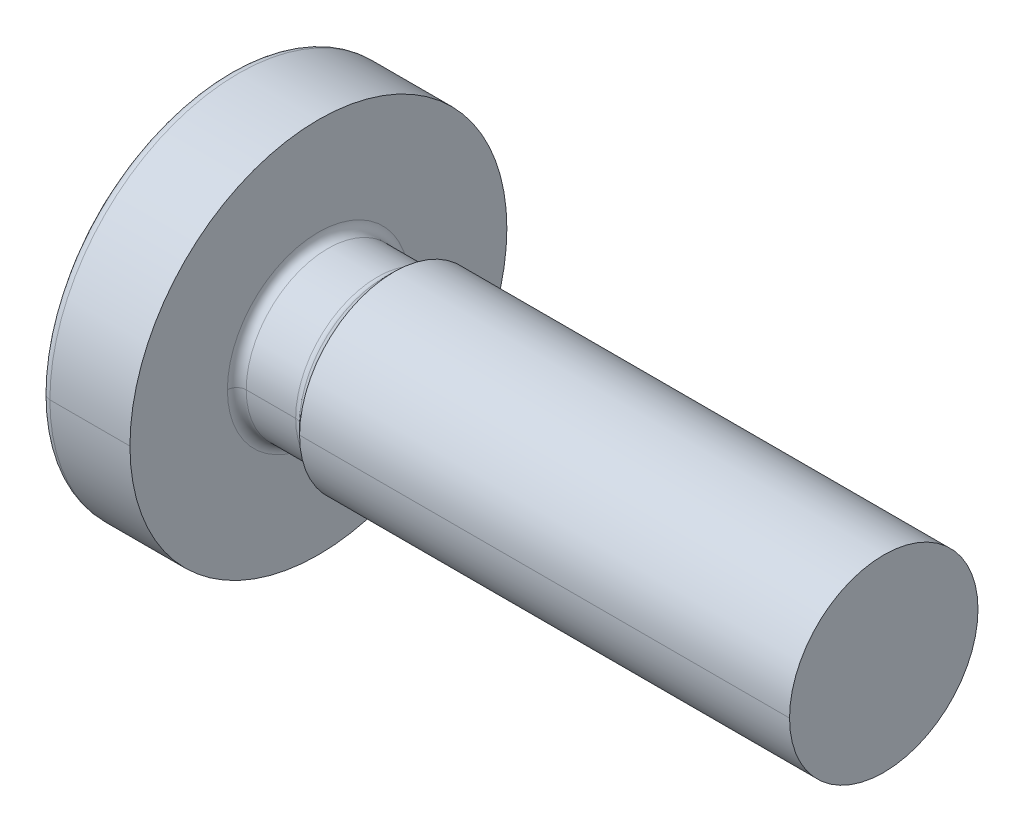
ISO-10303-21;
HEADER;
FILE_DESCRIPTION(('STEP AP214'),'2;1');
FILE_NAME('part.step','',(''),(''),'','','');
FILE_SCHEMA(('AUTOMOTIVE_DESIGN { 1 0 10303 214 1 1 1 1 }'));
ENDSEC;
DATA;
#1=APPLICATION_CONTEXT('core data for automotive mechanical design processes');
#2=APPLICATION_PROTOCOL_DEFINITION('international standard','automotive_design',2000,#1);
#3=PRODUCT_CONTEXT('',#1,'mechanical');
#4=PRODUCT('Part','Part','',(#3));
#5=PRODUCT_RELATED_PRODUCT_CATEGORY('part','',(#4));
#6=PRODUCT_DEFINITION_FORMATION('','',#4);
#7=PRODUCT_DEFINITION_CONTEXT('part definition',#1,'design');
#8=PRODUCT_DEFINITION('design','',#6,#7);
#9=PRODUCT_DEFINITION_SHAPE('','',#8);
#10=(LENGTH_UNIT() NAMED_UNIT(*) SI_UNIT(.MILLI.,.METRE.));
#11=(NAMED_UNIT(*) PLANE_ANGLE_UNIT() SI_UNIT($,.RADIAN.));
#12=(NAMED_UNIT(*) SI_UNIT($,.STERADIAN.) SOLID_ANGLE_UNIT());
#13=UNCERTAINTY_MEASURE_WITH_UNIT(LENGTH_MEASURE(1.E-05),#10,'distance_accuracy_value','');
#14=(GEOMETRIC_REPRESENTATION_CONTEXT(3) GLOBAL_UNCERTAINTY_ASSIGNED_CONTEXT((#13)) GLOBAL_UNIT_ASSIGNED_CONTEXT((#10,
#11,#12)) REPRESENTATION_CONTEXT('',''));
#15=CARTESIAN_POINT('',(0.,0.,0.));
#16=DIRECTION('',(0.,0.,1.));
#17=DIRECTION('',(1.,0.,0.));
#18=AXIS2_PLACEMENT_3D('',#15,#16,#17);
#19=CARTESIAN_POINT('',(1.7,0.,0.));
#20=DIRECTION('',(-1.,0.,0.));
#21=DIRECTION('',(0.,0.,1.));
#22=AXIS2_PLACEMENT_3D('',#19,#20,#21);
#23=TOROIDAL_SURFACE('',#22,0.966,0.1);
#24=CARTESIAN_POINT('',(1.6,0.,0.));
#25=DIRECTION('',(-1.,0.,0.));
#26=DIRECTION('',(0.,0.,1.));
#27=AXIS2_PLACEMENT_3D('',#24,#25,#26);
#28=CIRCLE('',#27,0.966);
#29=CARTESIAN_POINT('',(1.6,0.,-0.966));
#30=VERTEX_POINT('',#29);
#31=CARTESIAN_POINT('',(1.6,0.,0.966));
#32=VERTEX_POINT('',#31);
#33=EDGE_CURVE('E41',#30,#32,#28,.T.);
#34=ORIENTED_EDGE('',*,*,#33,.F.);
#35=CARTESIAN_POINT('',(1.7,0.,-0.966));
#36=DIRECTION('',(0.,1.,0.));
#37=DIRECTION('',(0.,0.,1.));
#38=AXIS2_PLACEMENT_3D('',#35,#36,#37);
#39=CIRCLE('',#38,0.1);
#40=CARTESIAN_POINT('',(1.7,0.,-0.866));
#41=VERTEX_POINT('',#40);
#42=EDGE_CURVE('E10',#30,#41,#39,.T.);
#43=ORIENTED_EDGE('',*,*,#42,.T.);
#44=CARTESIAN_POINT('',(1.7,0.,0.));
#45=DIRECTION('',(1.,0.,0.));
#46=DIRECTION('',(0.,0.,1.));
#47=AXIS2_PLACEMENT_3D('',#44,#45,#46);
#48=CIRCLE('',#47,0.866);
#49=CARTESIAN_POINT('',(1.7,0.,0.866));
#50=VERTEX_POINT('',#49);
#51=EDGE_CURVE('E371',#50,#41,#48,.T.);
#52=ORIENTED_EDGE('',*,*,#51,.F.);
#53=CARTESIAN_POINT('',(1.7,0.,0.966));
#54=DIRECTION('',(0.,-1.,0.));
#55=DIRECTION('',(0.,0.,-1.));
#56=AXIS2_PLACEMENT_3D('',#53,#54,#55);
#57=CIRCLE('',#56,0.1);
#58=EDGE_CURVE('E299',#32,#50,#57,.T.);
#59=ORIENTED_EDGE('',*,*,#58,.F.);
#60=EDGE_LOOP('',(#34,#43,#52,#59));
#61=FACE_BOUND('',#60,.T.);
#62=ADVANCED_FACE('F16',(#61),#23,.F.);
#63=CARTESIAN_POINT('',(2.2245786437627,0.,0.));
#64=DIRECTION('',(-1.,0.,0.));
#65=DIRECTION('',(0.,0.,1.));
#66=AXIS2_PLACEMENT_3D('',#63,#64,#65);
#67=TOROIDAL_SURFACE('',#66,0.966,0.1);
#68=CARTESIAN_POINT('',(2.2245786437627,0.,0.));
#69=DIRECTION('',(-1.,0.,0.));
#70=DIRECTION('',(0.,0.,1.));
#71=AXIS2_PLACEMENT_3D('',#68,#69,#70);
#72=CIRCLE('',#71,0.866);
#73=CARTESIAN_POINT('',(2.2245786437627,0.,-0.866));
#74=VERTEX_POINT('',#73);
#75=CARTESIAN_POINT('',(2.2245786437627,0.,0.866));
#76=VERTEX_POINT('',#75);
#77=EDGE_CURVE('E370',#74,#76,#72,.T.);
#78=ORIENTED_EDGE('',*,*,#77,.F.);
#79=CARTESIAN_POINT('',(2.2245786437627,0.,-0.966));
#80=DIRECTION('',(0.,1.,0.));
#81=DIRECTION('',(0.,0.,1.));
#82=AXIS2_PLACEMENT_3D('',#79,#80,#81);
#83=CIRCLE('',#82,0.1);
#84=CARTESIAN_POINT('',(2.29528932188135,0.,-0.895289321881345));
#85=VERTEX_POINT('',#84);
#86=EDGE_CURVE('E27',#74,#85,#83,.T.);
#87=ORIENTED_EDGE('',*,*,#86,.T.);
#88=CARTESIAN_POINT('',(2.29528932188135,0.,0.));
#89=DIRECTION('',(1.,0.,0.));
#90=DIRECTION('',(0.,0.,-1.));
#91=AXIS2_PLACEMENT_3D('',#88,#89,#90);
#92=CIRCLE('',#91,0.895289321881345);
#93=CARTESIAN_POINT('',(2.29528932188135,0.,0.895289321881345));
#94=VERTEX_POINT('',#93);
#95=EDGE_CURVE('E450',#94,#85,#92,.T.);
#96=ORIENTED_EDGE('',*,*,#95,.F.);
#97=CARTESIAN_POINT('',(2.2245786437627,0.,0.966));
#98=DIRECTION('',(0.,-1.,0.));
#99=DIRECTION('',(0.,0.,-1.));
#100=AXIS2_PLACEMENT_3D('',#97,#98,#99);
#101=CIRCLE('',#100,0.1);
#102=EDGE_CURVE('E302',#76,#94,#101,.T.);
#103=ORIENTED_EDGE('',*,*,#102,.F.);
#104=EDGE_LOOP('',(#78,#87,#96,#103));
#105=FACE_BOUND('',#104,.T.);
#106=ADVANCED_FACE('F1056',(#105),#67,.F.);
#107=CARTESIAN_POINT('',(0.750510257216821,0.,0.));
#108=DIRECTION('',(1.,0.,0.));
#109=DIRECTION('',(0.,0.,-1.));
#110=AXIS2_PLACEMENT_3D('',#107,#108,#109);
#111=TOROIDAL_SURFACE('',#110,1.9,0.1);
#112=CARTESIAN_POINT('',(0.671494459062525,0.,0.));
#113=DIRECTION('',(-1.,0.,0.));
#114=DIRECTION('',(0.,0.,-1.));
#115=AXIS2_PLACEMENT_3D('',#112,#113,#114);
#116=CIRCLE('',#115,1.96129032258065);
#117=CARTESIAN_POINT('',(0.671494459062525,0.,1.96129032258065));
#118=VERTEX_POINT('',#117);
#119=CARTESIAN_POINT('',(0.671494459062525,1.96129032258065,0.));
#120=VERTEX_POINT('',#119);
#121=EDGE_CURVE('E20',#118,#120,#116,.T.);
#122=ORIENTED_EDGE('',*,*,#121,.F.);
#123=CARTESIAN_POINT('',(0.750510257216821,0.,1.9));
#124=DIRECTION('',(0.,1.,0.));
#125=DIRECTION('',(0.,0.,1.));
#126=AXIS2_PLACEMENT_3D('',#123,#124,#125);
#127=CIRCLE('',#126,0.1);
#128=CARTESIAN_POINT('',(0.750510257216821,0.,2.));
#129=VERTEX_POINT('',#128);
#130=EDGE_CURVE('E462',#118,#129,#127,.T.);
#131=ORIENTED_EDGE('',*,*,#130,.T.);
#132=CARTESIAN_POINT('',(0.750510257216821,0.,0.));
#133=DIRECTION('',(1.,0.,0.));
#134=DIRECTION('',(0.,0.,-1.));
#135=AXIS2_PLACEMENT_3D('',#132,#133,#134);
#136=CIRCLE('',#135,2.);
#137=CARTESIAN_POINT('',(0.750510257216821,0.,-2.));
#138=VERTEX_POINT('',#137);
#139=EDGE_CURVE('E400',#138,#129,#136,.T.);
#140=ORIENTED_EDGE('',*,*,#139,.F.);
#141=CARTESIAN_POINT('',(0.750510257216821,0.,-1.9));
#142=DIRECTION('',(0.,-1.,0.));
#143=DIRECTION('',(0.,0.,-1.));
#144=AXIS2_PLACEMENT_3D('',#141,#142,#143);
#145=CIRCLE('',#144,0.1);
#146=CARTESIAN_POINT('',(0.671494459062525,0.,-1.96129032258065));
#147=VERTEX_POINT('',#146);
#148=EDGE_CURVE('E304',#147,#138,#145,.T.);
#149=ORIENTED_EDGE('',*,*,#148,.F.);
#150=CARTESIAN_POINT('',(0.671494459062525,0.,0.));
#151=DIRECTION('',(-1.,0.,0.));
#152=DIRECTION('',(0.,0.,-1.));
#153=AXIS2_PLACEMENT_3D('',#150,#151,#152);
#154=CIRCLE('',#153,1.96129032258065);
#155=EDGE_CURVE('E339',#120,#147,#154,.T.);
#156=ORIENTED_EDGE('',*,*,#155,.F.);
#157=EDGE_LOOP('',(#122,#131,#140,#149,#156));
#158=FACE_BOUND('',#157,.T.);
#159=ADVANCED_FACE('F1052',(#158),#111,.T.);
#160=CARTESIAN_POINT('',(-3.4420013783492,0.,0.));
#161=DIRECTION('',(-1.,0.,0.));
#162=DIRECTION('',(0.,0.,1.));
#163=AXIS2_PLACEMENT_3D('',#160,#161,#162);
#164=CYLINDRICAL_SURFACE('',#163,1.);
#165=CARTESIAN_POINT('',(7.6,0.,0.));
#166=DIRECTION('',(-1.,0.,0.));
#167=DIRECTION('',(0.,0.,1.));
#168=AXIS2_PLACEMENT_3D('',#165,#166,#167);
#169=CIRCLE('',#168,1.);
#170=CARTESIAN_POINT('',(7.6,0.,1.));
#171=VERTEX_POINT('',#170);
#172=CARTESIAN_POINT('',(7.6,0.,-1.));
#173=VERTEX_POINT('',#172);
#174=EDGE_CURVE('E440',#171,#173,#169,.T.);
#175=ORIENTED_EDGE('',*,*,#174,.T.);
#176=DIRECTION('',(-1.,0.,0.));
#177=VECTOR('',#176,1.);
#178=CARTESIAN_POINT('',(-3.4420013783492,0.,-1.));
#179=LINE('',#178,#177);
#180=CARTESIAN_POINT('',(2.4,0.,-1.));
#181=VERTEX_POINT('',#180);
#182=EDGE_CURVE('E416',#173,#181,#179,.T.);
#183=ORIENTED_EDGE('',*,*,#182,.T.);
#184=CARTESIAN_POINT('',(2.4,0.,0.));
#185=DIRECTION('',(-1.,0.,0.));
#186=DIRECTION('',(0.,0.,1.));
#187=AXIS2_PLACEMENT_3D('',#184,#185,#186);
#188=CIRCLE('',#187,1.);
#189=CARTESIAN_POINT('',(2.4,0.,1.));
#190=VERTEX_POINT('',#189);
#191=EDGE_CURVE('E313',#190,#181,#188,.T.);
#192=ORIENTED_EDGE('',*,*,#191,.F.);
#193=DIRECTION('',(-1.,0.,0.));
#194=VECTOR('',#193,1.);
#195=CARTESIAN_POINT('',(-3.4420013783492,0.,1.));
#196=LINE('',#195,#194);
#197=EDGE_CURVE('E221',#171,#190,#196,.T.);
#198=ORIENTED_EDGE('',*,*,#197,.F.);
#199=EDGE_LOOP('',(#175,#183,#192,#198));
#200=FACE_BOUND('',#199,.T.);
#201=ADVANCED_FACE('F1046',(#200),#164,.T.);
#202=CARTESIAN_POINT('',(2.4,0.,0.));
#203=DIRECTION('',(1.,0.,0.));
#204=DIRECTION('',(0.,0.,-1.));
#205=AXIS2_PLACEMENT_3D('',#202,#203,#204);
#206=CONICAL_SURFACE('',#205,1.,0.785398163397438);
#207=CARTESIAN_POINT('',(2.29528932188135,0.,0.));
#208=DIRECTION('',(1.,0.,0.));
#209=DIRECTION('',(0.,0.,-1.));
#210=AXIS2_PLACEMENT_3D('',#207,#208,#209);
#211=CIRCLE('',#210,0.895289321881345);
#212=EDGE_CURVE('E412',#85,#94,#211,.T.);
#213=ORIENTED_EDGE('',*,*,#212,.T.);
#214=DIRECTION('',(0.707106781186554,0.,0.707106781186541));
#215=VECTOR('',#214,1.);
#216=CARTESIAN_POINT('',(2.4,0.,1.));
#217=LINE('',#216,#215);
#218=EDGE_CURVE('E317',#94,#190,#217,.T.);
#219=ORIENTED_EDGE('',*,*,#218,.T.);
#220=ORIENTED_EDGE('',*,*,#191,.T.);
#221=DIRECTION('',(0.707106781186554,0.,-0.707106781186541));
#222=VECTOR('',#221,1.);
#223=CARTESIAN_POINT('',(2.4,0.,-1.));
#224=LINE('',#223,#222);
#225=EDGE_CURVE('E323',#85,#181,#224,.T.);
#226=ORIENTED_EDGE('',*,*,#225,.F.);
#227=EDGE_LOOP('',(#213,#219,#220,#226));
#228=FACE_BOUND('',#227,.T.);
#229=ADVANCED_FACE('F1041',(#228),#206,.T.);
#230=CARTESIAN_POINT('',(-3.4420013783492,0.,0.));
#231=DIRECTION('',(-1.,0.,0.));
#232=DIRECTION('',(0.,0.,1.));
#233=AXIS2_PLACEMENT_3D('',#230,#231,#232);
#234=CYLINDRICAL_SURFACE('',#233,0.866);
#235=CARTESIAN_POINT('',(2.2245786437627,0.,0.));
#236=DIRECTION('',(-1.,0.,0.));
#237=DIRECTION('',(0.,0.,1.));
#238=AXIS2_PLACEMENT_3D('',#235,#236,#237);
#239=CIRCLE('',#238,0.866);
#240=EDGE_CURVE('E318',#76,#74,#239,.T.);
#241=ORIENTED_EDGE('',*,*,#240,.T.);
#242=DIRECTION('',(-1.,0.,0.));
#243=VECTOR('',#242,1.);
#244=CARTESIAN_POINT('',(-3.4420013783492,0.,-0.866));
#245=LINE('',#244,#243);
#246=EDGE_CURVE('E459',#74,#41,#245,.T.);
#247=ORIENTED_EDGE('',*,*,#246,.T.);
#248=CARTESIAN_POINT('',(1.7,0.,0.));
#249=DIRECTION('',(1.,0.,0.));
#250=DIRECTION('',(0.,0.,1.));
#251=AXIS2_PLACEMENT_3D('',#248,#249,#250);
#252=CIRCLE('',#251,0.866);
#253=EDGE_CURVE('E484',#41,#50,#252,.T.);
#254=ORIENTED_EDGE('',*,*,#253,.T.);
#255=DIRECTION('',(-1.,0.,0.));
#256=VECTOR('',#255,1.);
#257=CARTESIAN_POINT('',(-3.4420013783492,0.,0.866));
#258=LINE('',#257,#256);
#259=EDGE_CURVE('E366',#76,#50,#258,.T.);
#260=ORIENTED_EDGE('',*,*,#259,.F.);
#261=EDGE_LOOP('',(#241,#247,#254,#260));
#262=FACE_BOUND('',#261,.T.);
#263=ADVANCED_FACE('F1045',(#262),#234,.T.);
#264=CARTESIAN_POINT('',(-3.4420013783492,0.,0.));
#265=DIRECTION('',(-1.,0.,0.));
#266=DIRECTION('',(0.,0.,1.));
#267=AXIS2_PLACEMENT_3D('',#264,#265,#266);
#268=CYLINDRICAL_SURFACE('',#267,2.);
#269=CARTESIAN_POINT('',(1.6,0.,0.));
#270=DIRECTION('',(-1.,0.,0.));
#271=DIRECTION('',(0.,0.,1.));
#272=AXIS2_PLACEMENT_3D('',#269,#270,#271);
#273=CIRCLE('',#272,2.);
#274=CARTESIAN_POINT('',(1.6,0.,2.));
#275=VERTEX_POINT('',#274);
#276=CARTESIAN_POINT('',(1.6,0.,-2.));
#277=VERTEX_POINT('',#276);
#278=EDGE_CURVE('E498',#275,#277,#273,.T.);
#279=ORIENTED_EDGE('',*,*,#278,.T.);
#280=DIRECTION('',(-1.,0.,0.));
#281=VECTOR('',#280,1.);
#282=CARTESIAN_POINT('',(-3.4420013783492,0.,-2.));
#283=LINE('',#282,#281);
#284=EDGE_CURVE('E208',#277,#138,#283,.T.);
#285=ORIENTED_EDGE('',*,*,#284,.T.);
#286=ORIENTED_EDGE('',*,*,#139,.T.);
#287=DIRECTION('',(-1.,0.,0.));
#288=VECTOR('',#287,1.);
#289=CARTESIAN_POINT('',(-3.4420013783492,0.,2.));
#290=LINE('',#289,#288);
#291=EDGE_CURVE('E534',#275,#129,#290,.T.);
#292=ORIENTED_EDGE('',*,*,#291,.F.);
#293=EDGE_LOOP('',(#279,#285,#286,#292));
#294=FACE_BOUND('',#293,.T.);
#295=ADVANCED_FACE('F1135',(#294),#268,.T.);
#296=CARTESIAN_POINT('',(3.2,0.,0.));
#297=DIRECTION('',(0.,0.,-1.));
#298=DIRECTION('',(0.,1.,0.));
#299=AXIS2_PLACEMENT_3D('',#296,#297,#298);
#300=SPHERICAL_SURFACE('',#299,3.2);
#301=ORIENTED_EDGE('',*,*,#155,.T.);
#302=CARTESIAN_POINT('',(0.671494459062525,0.,0.));
#303=DIRECTION('',(-1.,0.,0.));
#304=DIRECTION('',(0.,0.,-1.));
#305=AXIS2_PLACEMENT_3D('',#302,#303,#304);
#306=CIRCLE('',#305,1.96129032258065);
#307=CARTESIAN_POINT('',(0.671494459062525,-1.96129032258065,0.));
#308=VERTEX_POINT('',#307);
#309=EDGE_CURVE('E335',#147,#308,#306,.T.);
#310=ORIENTED_EDGE('',*,*,#309,.T.);
#311=CARTESIAN_POINT('',(3.2,0.,0.));
#312=DIRECTION('',(0.,0.,-1.));
#313=DIRECTION('',(0.,1.,0.));
#314=AXIS2_PLACEMENT_3D('',#311,#312,#313);
#315=CIRCLE('',#314,3.2);
#316=CARTESIAN_POINT('',(0.0354504651300945,-0.475001306687322,0.));
#317=VERTEX_POINT('',#316);
#318=EDGE_CURVE('E340',#308,#317,#315,.T.);
#319=ORIENTED_EDGE('',*,*,#318,.T.);
#320=CARTESIAN_POINT('',(3.20913082630883,-0.0743646126328122,0.0285459002690766));
#321=DIRECTION('',(0.113883497498907,-0.927506656060474,0.356036447517574));
#322=DIRECTION('',(0.,-0.358367949545296,-0.933580426497203));
#323=AXIS2_PLACEMENT_3D('',#320,#321,#322);
#324=CIRCLE('',#323,3.19899541481021);
#325=CARTESIAN_POINT('',(0.0530596989431761,-0.547110975398873,-0.193484682007979));
#326=VERTEX_POINT('',#325);
#327=EDGE_CURVE('E399',#317,#326,#324,.T.);
#328=ORIENTED_EDGE('',*,*,#327,.T.);
#329=CARTESIAN_POINT('',(3.19835264178885,0.0134166559625287,-0.0129563140584623));
#330=DIRECTION('',(0.0879813128153514,-0.716550290756221,0.691964572368024));
#331=DIRECTION('',(0.,-0.694658370458996,-0.719339800338653));
#332=AXIS2_PLACEMENT_3D('',#329,#330,#331);
#333=CIRCLE('',#332,3.19994522038733);
#334=CARTESIAN_POINT('',(0.177236360447902,-0.88738881521525,-0.561641406978353));
#335=VERTEX_POINT('',#334);
#336=EDGE_CURVE('E441',#326,#335,#333,.T.);
#337=ORIENTED_EDGE('',*,*,#336,.T.);
#338=CARTESIAN_POINT('',(3.00733905955363,0.27323883337656,0.27323883337656));
#339=DIRECTION('',(-0.446197814505031,0.632814155313759,0.63281415531376));
#340=DIRECTION('',(0.,-0.707106781186548,0.707106781186547));
#341=AXIS2_PLACEMENT_3D('',#338,#339,#340);
#342=CIRCLE('',#341,3.17073537872468);
#343=CARTESIAN_POINT('',(0.177236360841047,-0.561641406861888,-0.887388815054509));
#344=VERTEX_POINT('',#343);
#345=EDGE_CURVE('E480',#344,#335,#342,.T.);
#346=ORIENTED_EDGE('',*,*,#345,.F.);
#347=CARTESIAN_POINT('',(3.19835264178885,-0.0129563140584618,0.0134166559625281));
#348=DIRECTION('',(0.0879813128153511,0.691964572368024,-0.716550290756221));
#349=DIRECTION('',(0.,0.719339800338653,0.694658370458996));
#350=AXIS2_PLACEMENT_3D('',#347,#348,#349);
#351=CIRCLE('',#350,3.19994522038733);
#352=CARTESIAN_POINT('',(0.0530596989427369,-0.193484682007979,-0.547110975398927));
#353=VERTEX_POINT('',#352);
#354=EDGE_CURVE('E364',#344,#353,#351,.T.);
#355=ORIENTED_EDGE('',*,*,#354,.T.);
#356=CARTESIAN_POINT('',(3.20913082630883,0.0285459002690767,-0.0743646126328128));
#357=DIRECTION('',(0.113883497498907,0.356036447517573,-0.927506656060474));
#358=DIRECTION('',(0.,0.933580426497204,0.358367949545295));
#359=AXIS2_PLACEMENT_3D('',#356,#357,#358);
#360=CIRCLE('',#359,3.19899541481021);
#361=CARTESIAN_POINT('',(0.0354504651300949,0.,-0.475001306687322));
#362=VERTEX_POINT('',#361);
#363=EDGE_CURVE('E360',#353,#362,#360,.T.);
#364=ORIENTED_EDGE('',*,*,#363,.T.);
#365=CARTESIAN_POINT('',(3.20913082630883,-0.0285459002690767,-0.0743646126328126));
#366=DIRECTION('',(0.113883497498907,-0.356036447517574,-0.927506656060474));
#367=DIRECTION('',(0.,0.933580426497204,-0.358367949545295));
#368=AXIS2_PLACEMENT_3D('',#365,#366,#367);
#369=CIRCLE('',#368,3.19899541481021);
#370=CARTESIAN_POINT('',(0.0530596989431756,0.193484682007979,-0.547110975398873));
#371=VERTEX_POINT('',#370);
#372=EDGE_CURVE('E365',#362,#371,#369,.T.);
#373=ORIENTED_EDGE('',*,*,#372,.T.);
#374=CARTESIAN_POINT('',(3.19835264178885,0.012956314058462,0.0134166559625284));
#375=DIRECTION('',(0.0879813128153512,-0.691964572368025,-0.716550290756221));
#376=DIRECTION('',(0.,0.719339800338652,-0.694658370458996));
#377=AXIS2_PLACEMENT_3D('',#374,#375,#376);
#378=CIRCLE('',#377,3.19994522038733);
#379=CARTESIAN_POINT('',(0.177236360447902,0.561641406978353,-0.88738881521525));
#380=VERTEX_POINT('',#379);
#381=EDGE_CURVE('E491',#371,#380,#378,.T.);
#382=ORIENTED_EDGE('',*,*,#381,.T.);
#383=CARTESIAN_POINT('',(3.00733905955363,-0.27323883337656,0.27323883337656));
#384=DIRECTION('',(-0.446197814505031,-0.632814155313759,0.63281415531376));
#385=DIRECTION('',(0.,-0.707106781186548,-0.707106781186547));
#386=AXIS2_PLACEMENT_3D('',#383,#384,#385);
#387=CIRCLE('',#386,3.17073537872468);
#388=CARTESIAN_POINT('',(0.177236360447902,0.88738881521525,-0.561641406978353));
#389=VERTEX_POINT('',#388);
#390=EDGE_CURVE('E311',#389,#380,#387,.T.);
#391=ORIENTED_EDGE('',*,*,#390,.F.);
#392=CARTESIAN_POINT('',(3.19835264178885,-0.0134166559625285,-0.0129563140584621));
#393=DIRECTION('',(0.0879813128153513,0.716550290756221,0.691964572368025));
#394=DIRECTION('',(0.,-0.694658370458996,0.719339800338652));
#395=AXIS2_PLACEMENT_3D('',#392,#393,#394);
#396=CIRCLE('',#395,3.19994522038733);
#397=CARTESIAN_POINT('',(0.0530596989427363,0.547110975398927,-0.193484682007979));
#398=VERTEX_POINT('',#397);
#399=EDGE_CURVE('E495',#389,#398,#396,.T.);
#400=ORIENTED_EDGE('',*,*,#399,.T.);
#401=CARTESIAN_POINT('',(3.20913082630883,0.0743646126328124,0.0285459002690766));
#402=DIRECTION('',(0.113883497498907,0.927506656060474,0.356036447517574));
#403=DIRECTION('',(0.,-0.358367949545295,0.933580426497204));
#404=AXIS2_PLACEMENT_3D('',#401,#402,#403);
#405=CIRCLE('',#404,3.19899541481021);
#406=CARTESIAN_POINT('',(0.0354504651300943,0.475001306687322,0.));
#407=VERTEX_POINT('',#406);
#408=EDGE_CURVE('E507',#398,#407,#405,.T.);
#409=ORIENTED_EDGE('',*,*,#408,.T.);
#410=CARTESIAN_POINT('',(3.2,0.,0.));
#411=DIRECTION('',(0.,0.,1.));
#412=DIRECTION('',(1.,0.,0.));
#413=AXIS2_PLACEMENT_3D('',#410,#411,#412);
#414=CIRCLE('',#413,3.2);
#415=EDGE_CURVE('E409',#120,#407,#414,.T.);
#416=ORIENTED_EDGE('',*,*,#415,.F.);
#417=EDGE_LOOP('',(#301,#310,#319,#328,#337,#346,#355,#364,#373,#382,#391,#400,#409,#416));
#418=FACE_BOUND('',#417,.T.);
#419=ADVANCED_FACE('F1168',(#418),#300,.T.);
#420=CARTESIAN_POINT('',(3.2,0.,0.));
#421=DIRECTION('',(0.,0.,-1.));
#422=DIRECTION('',(0.,1.,0.));
#423=AXIS2_PLACEMENT_3D('',#420,#421,#422);
#424=SPHERICAL_SURFACE('',#423,3.2);
#425=ORIENTED_EDGE('',*,*,#318,.F.);
#426=CARTESIAN_POINT('',(0.671494459062525,0.,0.));
#427=DIRECTION('',(-1.,0.,0.));
#428=DIRECTION('',(0.,0.,-1.));
#429=AXIS2_PLACEMENT_3D('',#426,#427,#428);
#430=CIRCLE('',#429,1.96129032258065);
#431=EDGE_CURVE('E531',#308,#118,#430,.T.);
#432=ORIENTED_EDGE('',*,*,#431,.T.);
#433=ORIENTED_EDGE('',*,*,#121,.T.);
#434=ORIENTED_EDGE('',*,*,#415,.T.);
#435=CARTESIAN_POINT('',(3.20913082630883,0.0743646126328124,-0.0285459002690766));
#436=DIRECTION('',(0.113883497498907,0.927506656060474,-0.356036447517574));
#437=DIRECTION('',(0.,0.358367949545295,0.933580426497204));
#438=AXIS2_PLACEMENT_3D('',#435,#436,#437);
#439=CIRCLE('',#438,3.19899541481021);
#440=CARTESIAN_POINT('',(0.0530596989431758,0.547110975398873,0.193484682007979));
#441=VERTEX_POINT('',#440);
#442=EDGE_CURVE('E406',#407,#441,#439,.T.);
#443=ORIENTED_EDGE('',*,*,#442,.T.);
#444=CARTESIAN_POINT('',(3.19835264178885,-0.0134166559625286,0.0129563140584622));
#445=DIRECTION('',(0.0879813128153513,0.716550290756221,-0.691964572368025));
#446=DIRECTION('',(0.,0.694658370458996,0.719339800338652));
#447=AXIS2_PLACEMENT_3D('',#444,#445,#446);
#448=CIRCLE('',#447,3.19994522038733);
#449=CARTESIAN_POINT('',(0.177236360447901,0.88738881521525,0.561641406978354));
#450=VERTEX_POINT('',#449);
#451=EDGE_CURVE('E410',#441,#450,#448,.T.);
#452=ORIENTED_EDGE('',*,*,#451,.T.);
#453=CARTESIAN_POINT('',(3.00733905955363,-0.27323883337656,-0.27323883337656));
#454=DIRECTION('',(-0.446197814505031,-0.632814155313759,-0.63281415531376));
#455=DIRECTION('',(0.,0.707106781186548,-0.707106781186547));
#456=AXIS2_PLACEMENT_3D('',#453,#454,#455);
#457=CIRCLE('',#456,3.17073537872468);
#458=CARTESIAN_POINT('',(0.177236360841047,0.561641406861888,0.887388815054508));
#459=VERTEX_POINT('',#458);
#460=EDGE_CURVE('E328',#459,#450,#457,.T.);
#461=ORIENTED_EDGE('',*,*,#460,.F.);
#462=CARTESIAN_POINT('',(3.19835264178885,0.0129563140584621,-0.0134166559625284));
#463=DIRECTION('',(0.0879813128153512,-0.691964572368025,0.716550290756221));
#464=DIRECTION('',(0.,-0.719339800338652,-0.694658370458996));
#465=AXIS2_PLACEMENT_3D('',#462,#463,#464);
#466=CIRCLE('',#465,3.19994522038733);
#467=CARTESIAN_POINT('',(0.0530596989427367,0.193484682007979,0.547110975398927));
#468=VERTEX_POINT('',#467);
#469=EDGE_CURVE('E273',#459,#468,#466,.T.);
#470=ORIENTED_EDGE('',*,*,#469,.T.);
#471=CARTESIAN_POINT('',(3.20913082630883,-0.0285459002690767,0.0743646126328126));
#472=DIRECTION('',(0.113883497498907,-0.356036447517574,0.927506656060474));
#473=DIRECTION('',(0.,-0.933580426497204,-0.358367949545295));
#474=AXIS2_PLACEMENT_3D('',#471,#472,#473);
#475=CIRCLE('',#474,3.19899541481021);
#476=CARTESIAN_POINT('',(0.0354504651300946,0.,0.475001306687322));
#477=VERTEX_POINT('',#476);
#478=EDGE_CURVE('E267',#468,#477,#475,.T.);
#479=ORIENTED_EDGE('',*,*,#478,.T.);
#480=CARTESIAN_POINT('',(3.20913082630883,0.0285459002690767,0.0743646126328128));
#481=DIRECTION('',(0.113883497498907,0.356036447517573,0.927506656060474));
#482=DIRECTION('',(0.,-0.933580426497204,0.358367949545295));
#483=AXIS2_PLACEMENT_3D('',#480,#481,#482);
#484=CIRCLE('',#483,3.19899541481021);
#485=CARTESIAN_POINT('',(0.0530596989431759,-0.193484682007979,0.547110975398873));
#486=VERTEX_POINT('',#485);
#487=EDGE_CURVE('E260',#477,#486,#484,.T.);
#488=ORIENTED_EDGE('',*,*,#487,.T.);
#489=CARTESIAN_POINT('',(3.19835264178885,-0.0129563140584618,-0.0134166559625282));
#490=DIRECTION('',(0.0879813128153511,0.691964572368024,0.716550290756221));
#491=DIRECTION('',(0.,-0.719339800338653,0.694658370458996));
#492=AXIS2_PLACEMENT_3D('',#489,#490,#491);
#493=CIRCLE('',#492,3.19994522038733);
#494=CARTESIAN_POINT('',(0.177236360447902,-0.561641406978353,0.88738881521525));
#495=VERTEX_POINT('',#494);
#496=EDGE_CURVE('E268',#486,#495,#493,.T.);
#497=ORIENTED_EDGE('',*,*,#496,.T.);
#498=CARTESIAN_POINT('',(3.00733905955363,0.27323883337656,-0.27323883337656));
#499=DIRECTION('',(-0.446197814505031,0.632814155313759,-0.63281415531376));
#500=DIRECTION('',(0.,0.707106781186548,0.707106781186547));
#501=AXIS2_PLACEMENT_3D('',#498,#499,#500);
#502=CIRCLE('',#501,3.17073537872468);
#503=CARTESIAN_POINT('',(0.177236360841047,-0.887388815054508,0.561641406861888));
#504=VERTEX_POINT('',#503);
#505=EDGE_CURVE('E394',#504,#495,#502,.T.);
#506=ORIENTED_EDGE('',*,*,#505,.F.);
#507=CARTESIAN_POINT('',(3.19835264178885,0.0134166559625286,0.0129563140584622));
#508=DIRECTION('',(0.0879813128153513,-0.716550290756221,-0.691964572368025));
#509=DIRECTION('',(0.,0.694658370458996,-0.719339800338653));
#510=AXIS2_PLACEMENT_3D('',#507,#508,#509);
#511=CIRCLE('',#510,3.19994522038733);
#512=CARTESIAN_POINT('',(0.0530596989427363,-0.547110975398927,0.193484682007979));
#513=VERTEX_POINT('',#512);
#514=EDGE_CURVE('E298',#504,#513,#511,.T.);
#515=ORIENTED_EDGE('',*,*,#514,.T.);
#516=CARTESIAN_POINT('',(3.20913082630883,-0.0743646126328123,-0.0285459002690766));
#517=DIRECTION('',(0.113883497498907,-0.927506656060474,-0.356036447517574));
#518=DIRECTION('',(0.,0.358367949545296,-0.933580426497204));
#519=AXIS2_PLACEMENT_3D('',#516,#517,#518);
#520=CIRCLE('',#519,3.19899541481021);
#521=EDGE_CURVE('E466',#513,#317,#520,.T.);
#522=ORIENTED_EDGE('',*,*,#521,.T.);
#523=EDGE_LOOP('',(#425,#432,#433,#434,#443,#452,#461,#470,#479,#488,#497,#506,#515,#522));
#524=FACE_BOUND('',#523,.T.);
#525=ADVANCED_FACE('F271',(#524),#424,.T.);
#526=CARTESIAN_POINT('',(-3.4420013783492,0.,0.));
#527=DIRECTION('',(-1.,0.,0.));
#528=DIRECTION('',(0.,0.,1.));
#529=AXIS2_PLACEMENT_3D('',#526,#527,#528);
#530=CYLINDRICAL_SURFACE('',#529,2.);
#531=ORIENTED_EDGE('',*,*,#284,.F.);
#532=CARTESIAN_POINT('',(1.6,0.,0.));
#533=DIRECTION('',(-1.,0.,0.));
#534=DIRECTION('',(0.,0.,1.));
#535=AXIS2_PLACEMENT_3D('',#532,#533,#534);
#536=CIRCLE('',#535,2.);
#537=EDGE_CURVE('E470',#277,#275,#536,.T.);
#538=ORIENTED_EDGE('',*,*,#537,.T.);
#539=ORIENTED_EDGE('',*,*,#291,.T.);
#540=CARTESIAN_POINT('',(0.750510257216821,0.,0.));
#541=DIRECTION('',(1.,0.,0.));
#542=DIRECTION('',(0.,0.,-1.));
#543=AXIS2_PLACEMENT_3D('',#540,#541,#542);
#544=CIRCLE('',#543,2.);
#545=EDGE_CURVE('E424',#129,#138,#544,.T.);
#546=ORIENTED_EDGE('',*,*,#545,.T.);
#547=EDGE_LOOP('',(#531,#538,#539,#546));
#548=FACE_BOUND('',#547,.T.);
#549=ADVANCED_FACE('F1100',(#548),#530,.T.);
#550=CARTESIAN_POINT('',(1.6,2.,0.));
#551=DIRECTION('',(-1.,0.,0.));
#552=DIRECTION('',(0.,0.,1.));
#553=AXIS2_PLACEMENT_3D('',#550,#551,#552);
#554=PLANE('',#553);
#555=ORIENTED_EDGE('',*,*,#278,.F.);
#556=ORIENTED_EDGE('',*,*,#537,.F.);
#557=EDGE_LOOP('',(#555,#556));
#558=FACE_BOUND('',#557,.T.);
#559=CARTESIAN_POINT('',(1.6,0.,0.));
#560=DIRECTION('',(-1.,0.,0.));
#561=DIRECTION('',(0.,0.,1.));
#562=AXIS2_PLACEMENT_3D('',#559,#560,#561);
#563=CIRCLE('',#562,0.966);
#564=EDGE_CURVE('E420',#32,#30,#563,.T.);
#565=ORIENTED_EDGE('',*,*,#564,.T.);
#566=ORIENTED_EDGE('',*,*,#33,.T.);
#567=EDGE_LOOP('',(#565,#566));
#568=FACE_BOUND('',#567,.T.);
#569=ADVANCED_FACE('F942',(#558,#568),#554,.F.);
#570=CARTESIAN_POINT('',(-3.4420013783492,0.,0.));
#571=DIRECTION('',(-1.,0.,0.));
#572=DIRECTION('',(0.,0.,1.));
#573=AXIS2_PLACEMENT_3D('',#570,#571,#572);
#574=CYLINDRICAL_SURFACE('',#573,0.866);
#575=ORIENTED_EDGE('',*,*,#246,.F.);
#576=ORIENTED_EDGE('',*,*,#77,.T.);
#577=ORIENTED_EDGE('',*,*,#259,.T.);
#578=ORIENTED_EDGE('',*,*,#51,.T.);
#579=EDGE_LOOP('',(#575,#576,#577,#578));
#580=FACE_BOUND('',#579,.T.);
#581=ADVANCED_FACE('F937',(#580),#574,.T.);
#582=CARTESIAN_POINT('',(2.4,0.,0.));
#583=DIRECTION('',(1.,0.,0.));
#584=DIRECTION('',(0.,0.,-1.));
#585=AXIS2_PLACEMENT_3D('',#582,#583,#584);
#586=CONICAL_SURFACE('',#585,1.,0.785398163397438);
#587=ORIENTED_EDGE('',*,*,#218,.F.);
#588=ORIENTED_EDGE('',*,*,#95,.T.);
#589=ORIENTED_EDGE('',*,*,#225,.T.);
#590=CARTESIAN_POINT('',(2.4,0.,0.));
#591=DIRECTION('',(-1.,0.,0.));
#592=DIRECTION('',(0.,0.,1.));
#593=AXIS2_PLACEMENT_3D('',#590,#591,#592);
#594=CIRCLE('',#593,1.);
#595=EDGE_CURVE('E319',#181,#190,#594,.T.);
#596=ORIENTED_EDGE('',*,*,#595,.T.);
#597=EDGE_LOOP('',(#587,#588,#589,#596));
#598=FACE_BOUND('',#597,.T.);
#599=ADVANCED_FACE('F941',(#598),#586,.T.);
#600=CARTESIAN_POINT('',(-3.4420013783492,0.,0.));
#601=DIRECTION('',(-1.,0.,0.));
#602=DIRECTION('',(0.,0.,1.));
#603=AXIS2_PLACEMENT_3D('',#600,#601,#602);
#604=CYLINDRICAL_SURFACE('',#603,1.);
#605=ORIENTED_EDGE('',*,*,#182,.F.);
#606=CARTESIAN_POINT('',(7.6,0.,0.));
#607=DIRECTION('',(-1.,0.,0.));
#608=DIRECTION('',(0.,0.,1.));
#609=AXIS2_PLACEMENT_3D('',#606,#607,#608);
#610=CIRCLE('',#609,1.);
#611=EDGE_CURVE('E324',#173,#171,#610,.T.);
#612=ORIENTED_EDGE('',*,*,#611,.T.);
#613=ORIENTED_EDGE('',*,*,#197,.T.);
#614=ORIENTED_EDGE('',*,*,#595,.F.);
#615=EDGE_LOOP('',(#605,#612,#613,#614));
#616=FACE_BOUND('',#615,.T.);
#617=ADVANCED_FACE('F1070',(#616),#604,.T.);
#618=CARTESIAN_POINT('',(7.6,0.,0.));
#619=DIRECTION('',(-1.,0.,0.));
#620=DIRECTION('',(0.,0.,1.));
#621=AXIS2_PLACEMENT_3D('',#618,#619,#620);
#622=PLANE('',#621);
#623=ORIENTED_EDGE('',*,*,#174,.F.);
#624=ORIENTED_EDGE('',*,*,#611,.F.);
#625=EDGE_LOOP('',(#623,#624));
#626=FACE_BOUND('',#625,.T.);
#627=ADVANCED_FACE('F1075',(#626),#622,.F.);
#628=CARTESIAN_POINT('',(0.750510257216821,0.,0.));
#629=DIRECTION('',(1.,0.,0.));
#630=DIRECTION('',(0.,0.,-1.));
#631=AXIS2_PLACEMENT_3D('',#628,#629,#630);
#632=TOROIDAL_SURFACE('',#631,1.9,0.1);
#633=ORIENTED_EDGE('',*,*,#130,.F.);
#634=ORIENTED_EDGE('',*,*,#431,.F.);
#635=ORIENTED_EDGE('',*,*,#309,.F.);
#636=ORIENTED_EDGE('',*,*,#148,.T.);
#637=ORIENTED_EDGE('',*,*,#545,.F.);
#638=EDGE_LOOP('',(#633,#634,#635,#636,#637));
#639=FACE_BOUND('',#638,.T.);
#640=ADVANCED_FACE('F1010',(#639),#632,.T.);
#641=CARTESIAN_POINT('',(2.2245786437627,0.,0.));
#642=DIRECTION('',(-1.,0.,0.));
#643=DIRECTION('',(0.,0.,1.));
#644=AXIS2_PLACEMENT_3D('',#641,#642,#643);
#645=TOROIDAL_SURFACE('',#644,0.966,0.1);
#646=ORIENTED_EDGE('',*,*,#86,.F.);
#647=ORIENTED_EDGE('',*,*,#240,.F.);
#648=ORIENTED_EDGE('',*,*,#102,.T.);
#649=ORIENTED_EDGE('',*,*,#212,.F.);
#650=EDGE_LOOP('',(#646,#647,#648,#649));
#651=FACE_BOUND('',#650,.T.);
#652=ADVANCED_FACE('F921',(#651),#645,.F.);
#653=CARTESIAN_POINT('',(1.7,0.,0.));
#654=DIRECTION('',(-1.,0.,0.));
#655=DIRECTION('',(0.,0.,1.));
#656=AXIS2_PLACEMENT_3D('',#653,#654,#655);
#657=TOROIDAL_SURFACE('',#656,0.966,0.1);
#658=ORIENTED_EDGE('',*,*,#42,.F.);
#659=ORIENTED_EDGE('',*,*,#564,.F.);
#660=ORIENTED_EDGE('',*,*,#58,.T.);
#661=ORIENTED_EDGE('',*,*,#253,.F.);
#662=EDGE_LOOP('',(#658,#659,#660,#661));
#663=FACE_BOUND('',#662,.T.);
#664=ADVANCED_FACE('F18',(#663),#657,.F.);
#665=CARTESIAN_POINT('',(0.,0.959853768072267,-0.614145966921614));
#666=DIRECTION('',(0.0879813128153513,0.716550290756221,0.691964572368025));
#667=DIRECTION('',(0.992013508213441,0.,-0.126131675332016));
#668=AXIS2_PLACEMENT_3D('',#665,#666,#667);
#669=PLANE('',#668);
#670=DIRECTION('',(-0.892670261136446,0.364977639050132,-0.264444942995667));
#671=VECTOR('',#670,1.);
#672=CARTESIAN_POINT('',(0.71,0.669562789412696,-0.403815324464797));
#673=LINE('',#672,#671);
#674=CARTESIAN_POINT('',(1.42,0.379271810753126,-0.193484682007979));
#675=VERTEX_POINT('',#674);
#676=EDGE_CURVE('E378',#675,#389,#673,.T.);
#677=ORIENTED_EDGE('',*,*,#676,.F.);
#678=DIRECTION('',(0.992546151641322,-0.121869343405148,0.));
#679=VECTOR('',#678,1.);
#680=CARTESIAN_POINT('',(0.71,0.466448848994189,-0.193484682007979));
#681=LINE('',#680,#679);
#682=EDGE_CURVE('E303',#398,#675,#681,.T.);
#683=ORIENTED_EDGE('',*,*,#682,.F.);
#684=ORIENTED_EDGE('',*,*,#399,.F.);
#685=EDGE_LOOP('',(#677,#683,#684));
#686=FACE_BOUND('',#685,.T.);
#687=ADVANCED_FACE('F920',(#686),#669,.F.);
#688=CARTESIAN_POINT('',(0.,0.479354076482125,0.));
#689=DIRECTION('',(0.113883497498907,0.927506656060474,0.356036447517574));
#690=DIRECTION('',(0.952461542619366,0.,-0.304658841708456));
#691=AXIS2_PLACEMENT_3D('',#688,#689,#690);
#692=PLANE('',#691);
#693=ORIENTED_EDGE('',*,*,#682,.T.);
#694=DIRECTION('',(0.,-0.358367949545295,0.933580426497204));
#695=VECTOR('',#694,1.);
#696=CARTESIAN_POINT('',(1.42,0.305,0.));
#697=LINE('',#696,#695);
#698=CARTESIAN_POINT('',(1.42,0.305,0.));
#699=VERTEX_POINT('',#698);
#700=EDGE_CURVE('E419',#675,#699,#697,.T.);
#701=ORIENTED_EDGE('',*,*,#700,.T.);
#702=DIRECTION('',(0.992546151641322,-0.121869343405148,0.));
#703=VECTOR('',#702,1.);
#704=CARTESIAN_POINT('',(0.,0.479354076482125,0.));
#705=LINE('',#704,#703);
#706=EDGE_CURVE('E383',#407,#699,#705,.T.);
#707=ORIENTED_EDGE('',*,*,#706,.F.);
#708=ORIENTED_EDGE('',*,*,#408,.F.);
#709=EDGE_LOOP('',(#693,#701,#707,#708));
#710=FACE_BOUND('',#709,.T.);
#711=ADVANCED_FACE('F1001',(#710),#692,.F.);
#712=CARTESIAN_POINT('',(1.42,0.379271810753126,-0.193484682007979));
#713=DIRECTION('',(-0.446197814505031,-0.632814155313759,0.63281415531376));
#714=DIRECTION('',(-0.817268653268361,0.576256842375794,0.));
#715=AXIS2_PLACEMENT_3D('',#712,#713,#714);
#716=PLANE('',#715);
#717=ORIENTED_EDGE('',*,*,#390,.T.);
#718=DIRECTION('',(0.892670261136446,-0.264444942995667,0.364977639050132));
#719=VECTOR('',#718,1.);
#720=CARTESIAN_POINT('',(0.71,0.403815324464796,-0.669562789412696));
#721=LINE('',#720,#719);
#722=CARTESIAN_POINT('',(1.42,0.193484682007979,-0.379271810753126));
#723=VERTEX_POINT('',#722);
#724=EDGE_CURVE('E307',#380,#723,#721,.T.);
#725=ORIENTED_EDGE('',*,*,#724,.T.);
#726=DIRECTION('',(0.,0.707106781186548,0.707106781186547));
#727=VECTOR('',#726,1.);
#728=CARTESIAN_POINT('',(1.42,0.379271810753126,-0.193484682007979));
#729=LINE('',#728,#727);
#730=EDGE_CURVE('E312',#723,#675,#729,.T.);
#731=ORIENTED_EDGE('',*,*,#730,.T.);
#732=ORIENTED_EDGE('',*,*,#676,.T.);
#733=EDGE_LOOP('',(#717,#725,#731,#732));
#734=FACE_BOUND('',#733,.T.);
#735=ADVANCED_FACE('F997',(#734),#716,.T.);
#736=CARTESIAN_POINT('',(0.,0.479354076482125,0.));
#737=DIRECTION('',(0.113883497498907,0.927506656060474,-0.356036447517574));
#738=DIRECTION('',(-0.952461542619366,0.,-0.304658841708456));
#739=AXIS2_PLACEMENT_3D('',#736,#737,#738);
#740=PLANE('',#739);
#741=ORIENTED_EDGE('',*,*,#706,.T.);
#742=DIRECTION('',(0.,0.358367949545295,0.933580426497204));
#743=VECTOR('',#742,1.);
#744=CARTESIAN_POINT('',(1.42,0.305,0.));
#745=LINE('',#744,#743);
#746=CARTESIAN_POINT('',(1.42,0.379271810753126,0.193484682007979));
#747=VERTEX_POINT('',#746);
#748=EDGE_CURVE('E379',#699,#747,#745,.T.);
#749=ORIENTED_EDGE('',*,*,#748,.T.);
#750=DIRECTION('',(0.992546151641322,-0.121869343405148,0.));
#751=VECTOR('',#750,1.);
#752=CARTESIAN_POINT('',(0.,0.553625887235251,0.193484682007979));
#753=LINE('',#752,#751);
#754=EDGE_CURVE('E384',#441,#747,#753,.T.);
#755=ORIENTED_EDGE('',*,*,#754,.F.);
#756=ORIENTED_EDGE('',*,*,#442,.F.);
#757=EDGE_LOOP('',(#741,#749,#755,#756));
#758=FACE_BOUND('',#757,.T.);
#759=ADVANCED_FACE('F932',(#758),#740,.F.);
#760=CARTESIAN_POINT('',(0.,0.553625887235251,0.193484682007979));
#761=DIRECTION('',(0.0879813128153513,0.716550290756221,-0.691964572368025));
#762=DIRECTION('',(-0.992013508213441,0.,-0.126131675332016));
#763=AXIS2_PLACEMENT_3D('',#760,#761,#762);
#764=PLANE('',#763);
#765=ORIENTED_EDGE('',*,*,#754,.T.);
#766=DIRECTION('',(0.892670261136446,-0.364977639050132,-0.264444942995667));
#767=VECTOR('',#766,1.);
#768=CARTESIAN_POINT('',(0.71,0.669562789412696,0.403815324464797));
#769=LINE('',#768,#767);
#770=EDGE_CURVE('E325',#450,#747,#769,.T.);
#771=ORIENTED_EDGE('',*,*,#770,.F.);
#772=ORIENTED_EDGE('',*,*,#451,.F.);
#773=EDGE_LOOP('',(#765,#771,#772));
#774=FACE_BOUND('',#773,.T.);
#775=ADVANCED_FACE('F927',(#774),#764,.F.);
#776=CARTESIAN_POINT('',(1.42,0.193484682007979,0.379271810753126));
#777=DIRECTION('',(-0.446197814505031,-0.632814155313759,-0.63281415531376));
#778=DIRECTION('',(0.,-0.707106781186548,0.707106781186547));
#779=AXIS2_PLACEMENT_3D('',#776,#777,#778);
#780=PLANE('',#779);
#781=ORIENTED_EDGE('',*,*,#460,.T.);
#782=ORIENTED_EDGE('',*,*,#770,.T.);
#783=DIRECTION('',(0.,-0.707106781186548,0.707106781186547));
#784=VECTOR('',#783,1.);
#785=CARTESIAN_POINT('',(1.42,0.379271810753126,0.193484682007979));
#786=LINE('',#785,#784);
#787=CARTESIAN_POINT('',(1.42,0.193484682007979,0.379271810753126));
#788=VERTEX_POINT('',#787);
#789=EDGE_CURVE('E329',#747,#788,#786,.T.);
#790=ORIENTED_EDGE('',*,*,#789,.T.);
#791=DIRECTION('',(-0.892670261136446,0.264444942995667,0.364977639050132));
#792=VECTOR('',#791,1.);
#793=CARTESIAN_POINT('',(0.71,0.403815324464797,0.669562789412696));
#794=LINE('',#793,#792);
#795=EDGE_CURVE('E385',#788,#459,#794,.T.);
#796=ORIENTED_EDGE('',*,*,#795,.T.);
#797=EDGE_LOOP('',(#781,#782,#790,#796));
#798=FACE_BOUND('',#797,.T.);
#799=ADVANCED_FACE('F931',(#798),#780,.T.);
#800=CARTESIAN_POINT('',(0.,0.614145966921614,0.959853768072267));
#801=DIRECTION('',(0.0879813128153512,-0.691964572368025,0.716550290756221));
#802=DIRECTION('',(-0.992013508213441,-0.126131675332016,0.));
#803=AXIS2_PLACEMENT_3D('',#800,#801,#802);
#804=PLANE('',#803);
#805=ORIENTED_EDGE('',*,*,#795,.F.);
#806=DIRECTION('',(0.992546151641322,0.,-0.121869343405148));
#807=VECTOR('',#806,1.);
#808=CARTESIAN_POINT('',(0.71,0.193484682007979,0.466448848994189));
#809=LINE('',#808,#807);
#810=EDGE_CURVE('E290',#468,#788,#809,.T.);
#811=ORIENTED_EDGE('',*,*,#810,.F.);
#812=ORIENTED_EDGE('',*,*,#469,.F.);
#813=EDGE_LOOP('',(#805,#811,#812));
#814=FACE_BOUND('',#813,.T.);
#815=ADVANCED_FACE('F992',(#814),#804,.F.);
#816=CARTESIAN_POINT('',(0.,0.,0.479354076482125));
#817=DIRECTION('',(0.113883497498907,-0.356036447517574,0.927506656060474));
#818=DIRECTION('',(-0.952461542619366,-0.304658841708456,0.));
#819=AXIS2_PLACEMENT_3D('',#816,#817,#818);
#820=PLANE('',#819);
#821=ORIENTED_EDGE('',*,*,#810,.T.);
#822=DIRECTION('',(0.,-0.933580426497204,-0.358367949545296));
#823=VECTOR('',#822,1.);
#824=CARTESIAN_POINT('',(1.42,0.,0.305));
#825=LINE('',#824,#823);
#826=CARTESIAN_POINT('',(1.42,0.,0.305));
#827=VERTEX_POINT('',#826);
#828=EDGE_CURVE('E280',#788,#827,#825,.T.);
#829=ORIENTED_EDGE('',*,*,#828,.T.);
#830=DIRECTION('',(0.992546151641322,0.,-0.121869343405148));
#831=VECTOR('',#830,1.);
#832=CARTESIAN_POINT('',(0.,0.,0.479354076482125));
#833=LINE('',#832,#831);
#834=EDGE_CURVE('E132',#477,#827,#833,.T.);
#835=ORIENTED_EDGE('',*,*,#834,.F.);
#836=ORIENTED_EDGE('',*,*,#478,.F.);
#837=EDGE_LOOP('',(#821,#829,#835,#836));
#838=FACE_BOUND('',#837,.T.);
#839=ADVANCED_FACE('F278',(#838),#820,.F.);
#840=CARTESIAN_POINT('',(0.,0.,0.479354076482125));
#841=DIRECTION('',(0.113883497498907,0.356036447517573,0.927506656060474));
#842=DIRECTION('',(0.952461542619366,-0.304658841708456,0.));
#843=AXIS2_PLACEMENT_3D('',#840,#841,#842);
#844=PLANE('',#843);
#845=ORIENTED_EDGE('',*,*,#834,.T.);
#846=DIRECTION('',(0.,-0.933580426497203,0.358367949545296));
#847=VECTOR('',#846,1.);
#848=CARTESIAN_POINT('',(1.42,0.,0.305));
#849=LINE('',#848,#847);
#850=CARTESIAN_POINT('',(1.42,-0.193484682007979,0.379271810753126));
#851=VERTEX_POINT('',#850);
#852=EDGE_CURVE('E283',#827,#851,#849,.T.);
#853=ORIENTED_EDGE('',*,*,#852,.T.);
#854=DIRECTION('',(0.992546151641322,0.,-0.121869343405148));
#855=VECTOR('',#854,1.);
#856=CARTESIAN_POINT('',(0.,-0.193484682007979,0.553625887235251));
#857=LINE('',#856,#855);
#858=EDGE_CURVE('E263',#486,#851,#857,.T.);
#859=ORIENTED_EDGE('',*,*,#858,.F.);
#860=ORIENTED_EDGE('',*,*,#487,.F.);
#861=EDGE_LOOP('',(#845,#853,#859,#860));
#862=FACE_BOUND('',#861,.T.);
#863=ADVANCED_FACE('F262',(#862),#844,.F.);
#864=CARTESIAN_POINT('',(0.,-0.193484682007979,0.553625887235251));
#865=DIRECTION('',(0.0879813128153511,0.691964572368024,0.716550290756221));
#866=DIRECTION('',(0.992013508213441,-0.126131675332015,0.));
#867=AXIS2_PLACEMENT_3D('',#864,#865,#866);
#868=PLANE('',#867);
#869=ORIENTED_EDGE('',*,*,#858,.T.);
#870=DIRECTION('',(0.892670261136446,0.264444942995668,-0.364977639050131));
#871=VECTOR('',#870,1.);
#872=CARTESIAN_POINT('',(0.71,-0.403815324464797,0.669562789412696));
#873=LINE('',#872,#871);
#874=EDGE_CURVE('E143',#495,#851,#873,.T.);
#875=ORIENTED_EDGE('',*,*,#874,.F.);
#876=ORIENTED_EDGE('',*,*,#496,.F.);
#877=EDGE_LOOP('',(#869,#875,#876));
#878=FACE_BOUND('',#877,.T.);
#879=ADVANCED_FACE('F980',(#878),#868,.F.);
#880=CARTESIAN_POINT('',(1.42,-0.379271810753126,0.193484682007979));
#881=DIRECTION('',(-0.446197814505031,0.632814155313759,-0.63281415531376));
#882=DIRECTION('',(-0.817268653268361,0.,0.576256842375793));
#883=AXIS2_PLACEMENT_3D('',#880,#881,#882);
#884=PLANE('',#883);
#885=ORIENTED_EDGE('',*,*,#505,.T.);
#886=ORIENTED_EDGE('',*,*,#874,.T.);
#887=DIRECTION('',(0.,-0.707106781186548,-0.707106781186547));
#888=VECTOR('',#887,1.);
#889=CARTESIAN_POINT('',(1.42,-0.379271810753126,0.193484682007979));
#890=LINE('',#889,#888);
#891=CARTESIAN_POINT('',(1.42,-0.379271810753126,0.193484682007979));
#892=VERTEX_POINT('',#891);
#893=EDGE_CURVE('E395',#851,#892,#890,.T.);
#894=ORIENTED_EDGE('',*,*,#893,.T.);
#895=DIRECTION('',(-0.892670261136446,-0.364977639050131,0.264444942995667));
#896=VECTOR('',#895,1.);
#897=CARTESIAN_POINT('',(0.71,-0.669562789412696,0.403815324464797));
#898=LINE('',#897,#896);
#899=EDGE_CURVE('E428',#892,#504,#898,.T.);
#900=ORIENTED_EDGE('',*,*,#899,.T.);
#901=EDGE_LOOP('',(#885,#886,#894,#900));
#902=FACE_BOUND('',#901,.T.);
#903=ADVANCED_FACE('F974',(#902),#884,.T.);
#904=CARTESIAN_POINT('',(0.,-0.959853768072266,0.614145966921614));
#905=DIRECTION('',(0.0879813128153514,-0.716550290756221,-0.691964572368025));
#906=DIRECTION('',(0.,0.694658370458996,-0.719339800338653));
#907=AXIS2_PLACEMENT_3D('',#904,#905,#906);
#908=PLANE('',#907);
#909=ORIENTED_EDGE('',*,*,#899,.F.);
#910=DIRECTION('',(0.992546151641322,0.121869343405148,0.));
#911=VECTOR('',#910,1.);
#912=CARTESIAN_POINT('',(0.71,-0.466448848994189,0.193484682007979));
#913=LINE('',#912,#911);
#914=EDGE_CURVE('E156',#513,#892,#913,.T.);
#915=ORIENTED_EDGE('',*,*,#914,.F.);
#916=ORIENTED_EDGE('',*,*,#514,.F.);
#917=EDGE_LOOP('',(#909,#915,#916));
#918=FACE_BOUND('',#917,.T.);
#919=ADVANCED_FACE('F969',(#918),#908,.F.);
#920=CARTESIAN_POINT('',(0.,-0.479354076482125,0.));
#921=DIRECTION('',(0.113883497498907,-0.927506656060474,-0.356036447517574));
#922=DIRECTION('',(0.,0.358367949545296,-0.933580426497204));
#923=AXIS2_PLACEMENT_3D('',#920,#921,#922);
#924=PLANE('',#923);
#925=ORIENTED_EDGE('',*,*,#914,.T.);
#926=DIRECTION('',(0.,0.358367949545295,-0.933580426497204));
#927=VECTOR('',#926,1.);
#928=CARTESIAN_POINT('',(1.42,-0.305,0.));
#929=LINE('',#928,#927);
#930=CARTESIAN_POINT('',(1.42,-0.305,0.));
#931=VERTEX_POINT('',#930);
#932=EDGE_CURVE('E447',#892,#931,#929,.T.);
#933=ORIENTED_EDGE('',*,*,#932,.T.);
#934=DIRECTION('',(0.992546151641322,0.121869343405148,0.));
#935=VECTOR('',#934,1.);
#936=CARTESIAN_POINT('',(0.,-0.479354076482125,0.));
#937=LINE('',#936,#935);
#938=EDGE_CURVE('E345',#317,#931,#937,.T.);
#939=ORIENTED_EDGE('',*,*,#938,.F.);
#940=ORIENTED_EDGE('',*,*,#521,.F.);
#941=EDGE_LOOP('',(#925,#933,#939,#940));
#942=FACE_BOUND('',#941,.T.);
#943=ADVANCED_FACE('F973',(#942),#924,.F.);
#944=CARTESIAN_POINT('',(0.,-0.479354076482125,0.));
#945=DIRECTION('',(0.113883497498907,-0.927506656060474,0.356036447517574));
#946=DIRECTION('',(-0.992546151641322,-0.121869343405148,0.));
#947=AXIS2_PLACEMENT_3D('',#944,#945,#946);
#948=PLANE('',#947);
#949=ORIENTED_EDGE('',*,*,#938,.T.);
#950=DIRECTION('',(0.,-0.358367949545295,-0.933580426497204));
#951=VECTOR('',#950,1.);
#952=CARTESIAN_POINT('',(1.42,-0.305,0.));
#953=LINE('',#952,#951);
#954=CARTESIAN_POINT('',(1.42,-0.379271810753126,-0.193484682007979));
#955=VERTEX_POINT('',#954);
#956=EDGE_CURVE('E341',#931,#955,#953,.T.);
#957=ORIENTED_EDGE('',*,*,#956,.T.);
#958=DIRECTION('',(0.992546151641322,0.121869343405148,0.));
#959=VECTOR('',#958,1.);
#960=CARTESIAN_POINT('',(0.,-0.553625887235251,-0.193484682007979));
#961=LINE('',#960,#959);
#962=EDGE_CURVE('E346',#326,#955,#961,.T.);
#963=ORIENTED_EDGE('',*,*,#962,.F.);
#964=ORIENTED_EDGE('',*,*,#327,.F.);
#965=EDGE_LOOP('',(#949,#957,#963,#964));
#966=FACE_BOUND('',#965,.T.);
#967=ADVANCED_FACE('F1111',(#966),#948,.F.);
#968=CARTESIAN_POINT('',(0.,-0.553625887235251,-0.193484682007979));
#969=DIRECTION('',(0.0879813128153514,-0.716550290756221,0.691964572368025));
#970=DIRECTION('',(-0.992546151641322,-0.121869343405148,0.));
#971=AXIS2_PLACEMENT_3D('',#968,#969,#970);
#972=PLANE('',#971);
#973=ORIENTED_EDGE('',*,*,#962,.T.);
#974=DIRECTION('',(0.892670261136446,0.364977639050132,0.264444942995667));
#975=VECTOR('',#974,1.);
#976=CARTESIAN_POINT('',(0.71,-0.669562789412696,-0.403815324464797));
#977=LINE('',#976,#975);
#978=EDGE_CURVE('E474',#335,#955,#977,.T.);
#979=ORIENTED_EDGE('',*,*,#978,.F.);
#980=ORIENTED_EDGE('',*,*,#336,.F.);
#981=EDGE_LOOP('',(#973,#979,#980));
#982=FACE_BOUND('',#981,.T.);
#983=ADVANCED_FACE('F1035',(#982),#972,.F.);
#984=CARTESIAN_POINT('',(1.42,-0.193484682007979,-0.379271810753126));
#985=DIRECTION('',(-0.446197814505031,0.632814155313759,0.63281415531376));
#986=DIRECTION('',(0.81726865326836,0.576256842375794,0.));
#987=AXIS2_PLACEMENT_3D('',#984,#985,#986);
#988=PLANE('',#987);
#989=ORIENTED_EDGE('',*,*,#345,.T.);
#990=ORIENTED_EDGE('',*,*,#978,.T.);
#991=DIRECTION('',(0.,0.707106781186548,-0.707106781186547));
#992=VECTOR('',#991,1.);
#993=CARTESIAN_POINT('',(1.42,-0.379271810753126,-0.193484682007979));
#994=LINE('',#993,#992);
#995=CARTESIAN_POINT('',(1.42,-0.193484682007979,-0.379271810753126));
#996=VERTEX_POINT('',#995);
#997=EDGE_CURVE('E353',#955,#996,#994,.T.);
#998=ORIENTED_EDGE('',*,*,#997,.T.);
#999=DIRECTION('',(-0.892670261136446,-0.264444942995668,-0.364977639050131));
#1000=VECTOR('',#999,1.);
#1001=CARTESIAN_POINT('',(0.71,-0.403815324464797,-0.669562789412696));
#1002=LINE('',#1001,#1000);
#1003=EDGE_CURVE('E349',#996,#344,#1002,.T.);
#1004=ORIENTED_EDGE('',*,*,#1003,.T.);
#1005=EDGE_LOOP('',(#989,#990,#998,#1004));
#1006=FACE_BOUND('',#1005,.T.);
#1007=ADVANCED_FACE('F1031',(#1006),#988,.T.);
#1008=CARTESIAN_POINT('',(0.,-0.614145966921614,-0.959853768072266));
#1009=DIRECTION('',(0.0879813128153511,0.691964572368025,-0.716550290756221));
#1010=DIRECTION('',(-0.992546151641322,0.,-0.121869343405147));
#1011=AXIS2_PLACEMENT_3D('',#1008,#1009,#1010);
#1012=PLANE('',#1011);
#1013=ORIENTED_EDGE('',*,*,#1003,.F.);
#1014=DIRECTION('',(0.992546151641322,0.,0.121869343405148));
#1015=VECTOR('',#1014,1.);
#1016=CARTESIAN_POINT('',(0.71,-0.193484682007979,-0.466448848994189));
#1017=LINE('',#1016,#1015);
#1018=EDGE_CURVE('E354',#353,#996,#1017,.T.);
#1019=ORIENTED_EDGE('',*,*,#1018,.F.);
#1020=ORIENTED_EDGE('',*,*,#354,.F.);
#1021=EDGE_LOOP('',(#1013,#1019,#1020));
#1022=FACE_BOUND('',#1021,.T.);
#1023=ADVANCED_FACE('F953',(#1022),#1012,.F.);
#1024=CARTESIAN_POINT('',(0.,0.,-0.479354076482125));
#1025=DIRECTION('',(0.113883497498907,0.356036447517573,-0.927506656060474));
#1026=DIRECTION('',(-0.992546151641322,0.,-0.121869343405147));
#1027=AXIS2_PLACEMENT_3D('',#1024,#1025,#1026);
#1028=PLANE('',#1027);
#1029=ORIENTED_EDGE('',*,*,#1018,.T.);
#1030=DIRECTION('',(0.,0.933580426497203,0.358367949545296));
#1031=VECTOR('',#1030,1.);
#1032=CARTESIAN_POINT('',(1.42,0.,-0.305));
#1033=LINE('',#1032,#1031);
#1034=CARTESIAN_POINT('',(1.42,0.,-0.305));
#1035=VERTEX_POINT('',#1034);
#1036=EDGE_CURVE('E355',#996,#1035,#1033,.T.);
#1037=ORIENTED_EDGE('',*,*,#1036,.T.);
#1038=DIRECTION('',(0.992546151641322,0.,0.121869343405148));
#1039=VECTOR('',#1038,1.);
#1040=CARTESIAN_POINT('',(0.,0.,-0.479354076482125));
#1041=LINE('',#1040,#1039);
#1042=EDGE_CURVE('E359',#362,#1035,#1041,.T.);
#1043=ORIENTED_EDGE('',*,*,#1042,.F.);
#1044=ORIENTED_EDGE('',*,*,#363,.F.);
#1045=EDGE_LOOP('',(#1029,#1037,#1043,#1044));
#1046=FACE_BOUND('',#1045,.T.);
#1047=ADVANCED_FACE('F948',(#1046),#1028,.F.);
#1048=CARTESIAN_POINT('',(0.,0.,-0.479354076482125));
#1049=DIRECTION('',(0.113883497498907,-0.356036447517574,-0.927506656060474));
#1050=DIRECTION('',(0.,-0.933580426497204,0.358367949545296));
#1051=AXIS2_PLACEMENT_3D('',#1048,#1049,#1050);
#1052=PLANE('',#1051);
#1053=ORIENTED_EDGE('',*,*,#1042,.T.);
#1054=DIRECTION('',(0.,0.933580426497204,-0.358367949545296));
#1055=VECTOR('',#1054,1.);
#1056=CARTESIAN_POINT('',(1.42,0.,-0.305));
#1057=LINE('',#1056,#1055);
#1058=EDGE_CURVE('E334',#1035,#723,#1057,.T.);
#1059=ORIENTED_EDGE('',*,*,#1058,.T.);
#1060=DIRECTION('',(0.992546151641322,0.,0.121869343405148));
#1061=VECTOR('',#1060,1.);
#1062=CARTESIAN_POINT('',(0.,0.193484682007979,-0.553625887235251));
#1063=LINE('',#1062,#1061);
#1064=EDGE_CURVE('E330',#371,#723,#1063,.T.);
#1065=ORIENTED_EDGE('',*,*,#1064,.F.);
#1066=ORIENTED_EDGE('',*,*,#372,.F.);
#1067=EDGE_LOOP('',(#1053,#1059,#1065,#1066));
#1068=FACE_BOUND('',#1067,.T.);
#1069=ADVANCED_FACE('F952',(#1068),#1052,.F.);
#1070=CARTESIAN_POINT('',(0.,0.193484682007979,-0.553625887235251));
#1071=DIRECTION('',(0.0879813128153512,-0.691964572368025,-0.71655029075622));
#1072=DIRECTION('',(0.,-0.719339800338652,0.694658370458996));
#1073=AXIS2_PLACEMENT_3D('',#1070,#1071,#1072);
#1074=PLANE('',#1073);
#1075=ORIENTED_EDGE('',*,*,#1064,.T.);
#1076=ORIENTED_EDGE('',*,*,#724,.F.);
#1077=ORIENTED_EDGE('',*,*,#381,.F.);
#1078=EDGE_LOOP('',(#1075,#1076,#1077));
#1079=FACE_BOUND('',#1078,.T.);
#1080=ADVANCED_FACE('F959',(#1079),#1074,.F.);
#1081=CARTESIAN_POINT('',(1.42,0.367872003355029,-0.163787168415578));
#1082=DIRECTION('',(-1.,0.,0.));
#1083=DIRECTION('',(0.,0.,1.));
#1084=AXIS2_PLACEMENT_3D('',#1081,#1082,#1083);
#1085=PLANE('',#1084);
#1086=ORIENTED_EDGE('',*,*,#700,.F.);
#1087=ORIENTED_EDGE('',*,*,#730,.F.);
#1088=ORIENTED_EDGE('',*,*,#1058,.F.);
#1089=ORIENTED_EDGE('',*,*,#1036,.F.);
#1090=ORIENTED_EDGE('',*,*,#997,.F.);
#1091=ORIENTED_EDGE('',*,*,#956,.F.);
#1092=ORIENTED_EDGE('',*,*,#932,.F.);
#1093=ORIENTED_EDGE('',*,*,#893,.F.);
#1094=ORIENTED_EDGE('',*,*,#852,.F.);
#1095=ORIENTED_EDGE('',*,*,#828,.F.);
#1096=ORIENTED_EDGE('',*,*,#789,.F.);
#1097=ORIENTED_EDGE('',*,*,#748,.F.);
#1098=EDGE_LOOP('',(#1086,#1087,#1088,#1089,#1090,#1091,#1092,#1093,#1094,#1095,#1096,#1097));
#1099=FACE_BOUND('',#1098,.T.);
#1100=ADVANCED_FACE('F963',(#1099),#1085,.T.);
#1101=CLOSED_SHELL('',(#62,#106,#159,#201,#229,#263,#295,#419,#525,#549,#569,#581,#599,#617,
#627,#640,#652,#664,#687,#711,#735,#759,#775,#799,#815,#839,#863,#879,#903,#919,#943,#967,#983,
#1007,#1023,#1047,#1069,#1080,#1100));
#1102=MANIFOLD_SOLID_BREP('B1',#1101);
#1103=ADVANCED_BREP_SHAPE_REPRESENTATION('',(#18,#1102),#14);
#1104=SHAPE_DEFINITION_REPRESENTATION(#9,#1103);
ENDSEC;
END-ISO-10303-21;
